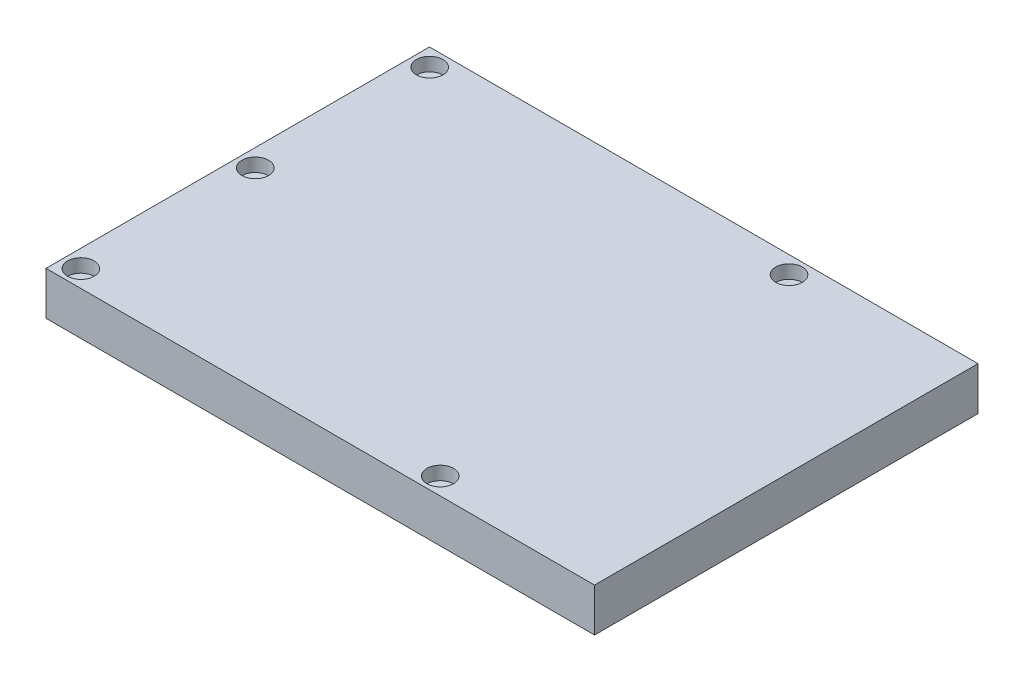
ISO-10303-21;
HEADER;
FILE_DESCRIPTION(('STEP AP214'),'2;1');
FILE_NAME('part.step','',(''),(''),'','','');
FILE_SCHEMA(('AUTOMOTIVE_DESIGN { 1 0 10303 214 1 1 1 1 }'));
ENDSEC;
DATA;
#1=APPLICATION_CONTEXT('core data for automotive mechanical design processes');
#2=APPLICATION_PROTOCOL_DEFINITION('international standard','automotive_design',2000,#1);
#3=PRODUCT_CONTEXT('',#1,'mechanical');
#4=PRODUCT('Part','Part','',(#3));
#5=PRODUCT_RELATED_PRODUCT_CATEGORY('part','',(#4));
#6=PRODUCT_DEFINITION_FORMATION('','',#4);
#7=PRODUCT_DEFINITION_CONTEXT('part definition',#1,'design');
#8=PRODUCT_DEFINITION('design','',#6,#7);
#9=PRODUCT_DEFINITION_SHAPE('','',#8);
#10=(LENGTH_UNIT() NAMED_UNIT(*) SI_UNIT(.MILLI.,.METRE.));
#11=(NAMED_UNIT(*) PLANE_ANGLE_UNIT() SI_UNIT($,.RADIAN.));
#12=(NAMED_UNIT(*) SI_UNIT($,.STERADIAN.) SOLID_ANGLE_UNIT());
#13=UNCERTAINTY_MEASURE_WITH_UNIT(LENGTH_MEASURE(1.E-05),#10,'distance_accuracy_value','');
#14=(GEOMETRIC_REPRESENTATION_CONTEXT(3) GLOBAL_UNCERTAINTY_ASSIGNED_CONTEXT((#13)) GLOBAL_UNIT_ASSIGNED_CONTEXT((#10,
#11,#12)) REPRESENTATION_CONTEXT('',''));
#15=CARTESIAN_POINT('',(0.,0.,0.));
#16=DIRECTION('',(0.,0.,1.));
#17=DIRECTION('',(1.,0.,0.));
#18=AXIS2_PLACEMENT_3D('',#15,#16,#17);
#19=CARTESIAN_POINT('',(63.336586242594,10.,-44.2744891451871));
#20=DIRECTION('',(0.,0.,1.));
#21=DIRECTION('',(1.,0.,0.));
#22=AXIS2_PLACEMENT_3D('',#19,#20,#21);
#23=PLANE('',#22);
#24=DIRECTION('',(-1.,0.,0.));
#25=VECTOR('',#24,1.);
#26=CARTESIAN_POINT('',(63.336586242594,0.,-44.2744891451871));
#27=LINE('',#26,#25);
#28=CARTESIAN_POINT('',(63.336586242594,0.,-44.2744891451871));
#29=VERTEX_POINT('',#28);
#30=CARTESIAN_POINT('',(-63.336586242594,0.,-44.2744891451871));
#31=VERTEX_POINT('',#30);
#32=EDGE_CURVE('E113',#29,#31,#27,.T.);
#33=ORIENTED_EDGE('',*,*,#32,.T.);
#34=DIRECTION('',(0.,-1.,0.));
#35=VECTOR('',#34,1.);
#36=CARTESIAN_POINT('',(-63.336586242594,10.,-44.2744891451871));
#37=LINE('',#36,#35);
#38=CARTESIAN_POINT('',(-63.336586242594,10.,-44.2744891451871));
#39=VERTEX_POINT('',#38);
#40=EDGE_CURVE('E11',#39,#31,#37,.T.);
#41=ORIENTED_EDGE('',*,*,#40,.F.);
#42=DIRECTION('',(-1.,0.,0.));
#43=VECTOR('',#42,1.);
#44=CARTESIAN_POINT('',(63.336586242594,10.,-44.2744891451871));
#45=LINE('',#44,#43);
#46=CARTESIAN_POINT('',(63.336586242594,10.,-44.2744891451871));
#47=VERTEX_POINT('',#46);
#48=EDGE_CURVE('E97',#47,#39,#45,.T.);
#49=ORIENTED_EDGE('',*,*,#48,.F.);
#50=DIRECTION('',(0.,-1.,0.));
#51=VECTOR('',#50,1.);
#52=CARTESIAN_POINT('',(63.336586242594,10.,-44.2744891451871));
#53=LINE('',#52,#51);
#54=EDGE_CURVE('E109',#47,#29,#53,.T.);
#55=ORIENTED_EDGE('',*,*,#54,.T.);
#56=EDGE_LOOP('',(#33,#41,#49,#55));
#57=FACE_BOUND('',#56,.T.);
#58=ADVANCED_FACE('F45',(#57),#23,.F.);
#59=CARTESIAN_POINT('',(-63.336586242594,10.,-44.2744891451871));
#60=DIRECTION('',(1.,0.,0.));
#61=DIRECTION('',(0.,0.,-1.));
#62=AXIS2_PLACEMENT_3D('',#59,#60,#61);
#63=PLANE('',#62);
#64=DIRECTION('',(0.,0.,1.));
#65=VECTOR('',#64,1.);
#66=CARTESIAN_POINT('',(-63.336586242594,0.,-44.2744891451871));
#67=LINE('',#66,#65);
#68=CARTESIAN_POINT('',(-63.336586242594,0.,44.2744891451871));
#69=VERTEX_POINT('',#68);
#70=EDGE_CURVE('E102',#31,#69,#67,.T.);
#71=ORIENTED_EDGE('',*,*,#70,.T.);
#72=DIRECTION('',(0.,-1.,0.));
#73=VECTOR('',#72,1.);
#74=CARTESIAN_POINT('',(-63.336586242594,10.,44.2744891451871));
#75=LINE('',#74,#73);
#76=CARTESIAN_POINT('',(-63.336586242594,10.,44.2744891451871));
#77=VERTEX_POINT('',#76);
#78=EDGE_CURVE('E54',#77,#69,#75,.T.);
#79=ORIENTED_EDGE('',*,*,#78,.F.);
#80=DIRECTION('',(0.,0.,1.));
#81=VECTOR('',#80,1.);
#82=CARTESIAN_POINT('',(-63.336586242594,10.,-44.2744891451871));
#83=LINE('',#82,#81);
#84=EDGE_CURVE('E92',#39,#77,#83,.T.);
#85=ORIENTED_EDGE('',*,*,#84,.F.);
#86=ORIENTED_EDGE('',*,*,#40,.T.);
#87=EDGE_LOOP('',(#71,#79,#85,#86));
#88=FACE_BOUND('',#87,.T.);
#89=ADVANCED_FACE('F101',(#88),#63,.F.);
#90=CARTESIAN_POINT('',(-63.336586242594,10.,44.2744891451871));
#91=DIRECTION('',(0.,0.,-1.));
#92=DIRECTION('',(-1.,0.,0.));
#93=AXIS2_PLACEMENT_3D('',#90,#91,#92);
#94=PLANE('',#93);
#95=DIRECTION('',(1.,0.,0.));
#96=VECTOR('',#95,1.);
#97=CARTESIAN_POINT('',(-63.336586242594,0.,44.2744891451871));
#98=LINE('',#97,#96);
#99=CARTESIAN_POINT('',(63.336586242594,0.,44.2744891451871));
#100=VERTEX_POINT('',#99);
#101=EDGE_CURVE('E79',#69,#100,#98,.T.);
#102=ORIENTED_EDGE('',*,*,#101,.T.);
#103=DIRECTION('',(0.,-1.,0.));
#104=VECTOR('',#103,1.);
#105=CARTESIAN_POINT('',(63.336586242594,10.,44.2744891451871));
#106=LINE('',#105,#104);
#107=CARTESIAN_POINT('',(63.336586242594,10.,44.2744891451871));
#108=VERTEX_POINT('',#107);
#109=EDGE_CURVE('E104',#108,#100,#106,.T.);
#110=ORIENTED_EDGE('',*,*,#109,.F.);
#111=DIRECTION('',(1.,0.,0.));
#112=VECTOR('',#111,1.);
#113=CARTESIAN_POINT('',(-63.336586242594,10.,44.2744891451871));
#114=LINE('',#113,#112);
#115=EDGE_CURVE('E95',#77,#108,#114,.T.);
#116=ORIENTED_EDGE('',*,*,#115,.F.);
#117=ORIENTED_EDGE('',*,*,#78,.T.);
#118=EDGE_LOOP('',(#102,#110,#116,#117));
#119=FACE_BOUND('',#118,.T.);
#120=ADVANCED_FACE('F105',(#119),#94,.F.);
#121=CARTESIAN_POINT('',(63.336586242594,10.,44.2744891451871));
#122=DIRECTION('',(-1.,0.,0.));
#123=DIRECTION('',(0.,0.,1.));
#124=AXIS2_PLACEMENT_3D('',#121,#122,#123);
#125=PLANE('',#124);
#126=DIRECTION('',(0.,0.,-1.));
#127=VECTOR('',#126,1.);
#128=CARTESIAN_POINT('',(63.336586242594,0.,44.2744891451871));
#129=LINE('',#128,#127);
#130=EDGE_CURVE('E85',#100,#29,#129,.T.);
#131=ORIENTED_EDGE('',*,*,#130,.T.);
#132=ORIENTED_EDGE('',*,*,#54,.F.);
#133=DIRECTION('',(0.,0.,-1.));
#134=VECTOR('',#133,1.);
#135=CARTESIAN_POINT('',(63.336586242594,10.,44.2744891451871));
#136=LINE('',#135,#134);
#137=EDGE_CURVE('E62',#108,#47,#136,.T.);
#138=ORIENTED_EDGE('',*,*,#137,.F.);
#139=ORIENTED_EDGE('',*,*,#109,.T.);
#140=EDGE_LOOP('',(#131,#132,#138,#139));
#141=FACE_BOUND('',#140,.T.);
#142=ADVANCED_FACE('F127',(#141),#125,.F.);
#143=CARTESIAN_POINT('',(0.,10.,0.));
#144=DIRECTION('',(0.,1.,0.));
#145=DIRECTION('',(0.,0.,1.));
#146=AXIS2_PLACEMENT_3D('',#143,#144,#145);
#147=PLANE('',#146);
#148=CARTESIAN_POINT('',(23.7198426761266,10.,-40.2490943681592));
#149=DIRECTION('',(0.,1.,0.));
#150=DIRECTION('',(0.,0.,1.));
#151=AXIS2_PLACEMENT_3D('',#148,#149,#150);
#152=CIRCLE('',#151,3.07499999999999);
#153=CARTESIAN_POINT('',(23.7198426761266,10.,-37.1740943681592));
#154=VERTEX_POINT('',#153);
#155=EDGE_CURVE('E146',#154,#154,#152,.T.);
#156=ORIENTED_EDGE('',*,*,#155,.F.);
#157=EDGE_LOOP('',(#156));
#158=FACE_BOUND('',#157,.T.);
#159=CARTESIAN_POINT('',(23.7198426761266,10.,40.2990575091822));
#160=DIRECTION('',(0.,1.,0.));
#161=DIRECTION('',(0.,0.,1.));
#162=AXIS2_PLACEMENT_3D('',#159,#160,#161);
#163=CIRCLE('',#162,3.07499999999999);
#164=CARTESIAN_POINT('',(23.7198426761266,10.,43.3740575091822));
#165=VERTEX_POINT('',#164);
#166=EDGE_CURVE('E154',#165,#165,#163,.T.);
#167=ORIENTED_EDGE('',*,*,#166,.F.);
#168=EDGE_LOOP('',(#167));
#169=FACE_BOUND('',#168,.T.);
#170=CARTESIAN_POINT('',(-59.2646422034682,10.,40.2990575091822));
#171=DIRECTION('',(0.,1.,0.));
#172=DIRECTION('',(0.,0.,1.));
#173=AXIS2_PLACEMENT_3D('',#170,#171,#172);
#174=CIRCLE('',#173,3.07499999999999);
#175=CARTESIAN_POINT('',(-59.2646422034682,10.,43.3740575091822));
#176=VERTEX_POINT('',#175);
#177=EDGE_CURVE('E162',#176,#176,#174,.T.);
#178=ORIENTED_EDGE('',*,*,#177,.F.);
#179=EDGE_LOOP('',(#178));
#180=FACE_BOUND('',#179,.T.);
#181=CARTESIAN_POINT('',(-59.2646422034682,10.,0.0249815705114721));
#182=DIRECTION('',(0.,1.,0.));
#183=DIRECTION('',(0.,0.,1.));
#184=AXIS2_PLACEMENT_3D('',#181,#182,#183);
#185=CIRCLE('',#184,3.07499999999999);
#186=CARTESIAN_POINT('',(-59.2646422034682,10.,3.09998157051146));
#187=VERTEX_POINT('',#186);
#188=EDGE_CURVE('E138',#187,#187,#185,.T.);
#189=ORIENTED_EDGE('',*,*,#188,.F.);
#190=EDGE_LOOP('',(#189));
#191=FACE_BOUND('',#190,.T.);
#192=CARTESIAN_POINT('',(-59.2646422034682,10.,-40.2490943681592));
#193=DIRECTION('',(0.,1.,0.));
#194=DIRECTION('',(0.,0.,1.));
#195=AXIS2_PLACEMENT_3D('',#192,#193,#194);
#196=CIRCLE('',#195,3.075);
#197=CARTESIAN_POINT('',(-59.2646422034682,10.,-37.1740943681592));
#198=VERTEX_POINT('',#197);
#199=EDGE_CURVE('E134',#198,#198,#196,.T.);
#200=ORIENTED_EDGE('',*,*,#199,.F.);
#201=EDGE_LOOP('',(#200));
#202=FACE_BOUND('',#201,.T.);
#203=ORIENTED_EDGE('',*,*,#48,.T.);
#204=ORIENTED_EDGE('',*,*,#84,.T.);
#205=ORIENTED_EDGE('',*,*,#115,.T.);
#206=ORIENTED_EDGE('',*,*,#137,.T.);
#207=EDGE_LOOP('',(#203,#204,#205,#206));
#208=FACE_BOUND('',#207,.T.);
#209=ADVANCED_FACE('F93',(#158,#169,#180,#191,#202,#208),#147,.T.);
#210=CARTESIAN_POINT('',(0.,0.,0.));
#211=DIRECTION('',(0.,1.,0.));
#212=DIRECTION('',(0.,0.,1.));
#213=AXIS2_PLACEMENT_3D('',#210,#211,#212);
#214=PLANE('',#213);
#215=ORIENTED_EDGE('',*,*,#32,.F.);
#216=ORIENTED_EDGE('',*,*,#130,.F.);
#217=ORIENTED_EDGE('',*,*,#101,.F.);
#218=ORIENTED_EDGE('',*,*,#70,.F.);
#219=EDGE_LOOP('',(#215,#216,#217,#218));
#220=FACE_BOUND('',#219,.T.);
#221=ADVANCED_FACE('F130',(#220),#214,.F.);
#222=CARTESIAN_POINT('',(-59.2646422034682,6.9,-40.2490943681592));
#223=DIRECTION('',(0.,1.,0.));
#224=DIRECTION('',(0.,0.,1.));
#225=AXIS2_PLACEMENT_3D('',#222,#223,#224);
#226=CYLINDRICAL_SURFACE('',#225,3.075);
#227=CARTESIAN_POINT('',(-59.2646422034682,6.9,-40.2490943681592));
#228=DIRECTION('',(0.,1.,0.));
#229=DIRECTION('',(0.,0.,1.));
#230=AXIS2_PLACEMENT_3D('',#227,#228,#229);
#231=CIRCLE('',#230,3.075);
#232=CARTESIAN_POINT('',(-59.2646422034682,6.9,-37.1740943681592));
#233=VERTEX_POINT('',#232);
#234=EDGE_CURVE('E117',#233,#233,#231,.T.);
#235=CARTESIAN_POINT('',(-59.2646422034682,6.9,-37.1740943681592));
#236=CARTESIAN_POINT('',(-59.2646422034682,6.93229166666667,-37.1740943681592));
#237=CARTESIAN_POINT('',(-59.2646422034682,6.96458333333333,-37.1740943681592));
#238=CARTESIAN_POINT('',(-59.2646422034682,7.02916666666667,-37.1740943681592));
#239=CARTESIAN_POINT('',(-59.2646422034682,7.06145833333333,-37.1740943681592));
#240=CARTESIAN_POINT('',(-59.2646422034682,7.12604166666667,-37.1740943681592));
#241=CARTESIAN_POINT('',(-59.2646422034682,7.15833333333333,-37.1740943681592));
#242=CARTESIAN_POINT('',(-59.2646422034682,7.22291666666667,-37.1740943681592));
#243=CARTESIAN_POINT('',(-59.2646422034682,7.25520833333333,-37.1740943681592));
#244=CARTESIAN_POINT('',(-59.2646422034682,7.31979166666667,-37.1740943681592));
#245=CARTESIAN_POINT('',(-59.2646422034682,7.35208333333333,-37.1740943681592));
#246=CARTESIAN_POINT('',(-59.2646422034682,7.41666666666667,-37.1740943681592));
#247=CARTESIAN_POINT('',(-59.2646422034682,7.44895833333333,-37.1740943681592));
#248=CARTESIAN_POINT('',(-59.2646422034682,7.51354166666667,-37.1740943681592));
#249=CARTESIAN_POINT('',(-59.2646422034682,7.54583333333333,-37.1740943681592));
#250=CARTESIAN_POINT('',(-59.2646422034682,7.61041666666667,-37.1740943681592));
#251=CARTESIAN_POINT('',(-59.2646422034682,7.64270833333333,-37.1740943681592));
#252=CARTESIAN_POINT('',(-59.2646422034682,7.70729166666667,-37.1740943681592));
#253=CARTESIAN_POINT('',(-59.2646422034682,7.73958333333333,-37.1740943681592));
#254=CARTESIAN_POINT('',(-59.2646422034682,7.80416666666667,-37.1740943681592));
#255=CARTESIAN_POINT('',(-59.2646422034682,7.83645833333333,-37.1740943681592));
#256=CARTESIAN_POINT('',(-59.2646422034682,7.90104166666667,-37.1740943681592));
#257=CARTESIAN_POINT('',(-59.2646422034682,7.93333333333333,-37.1740943681592));
#258=CARTESIAN_POINT('',(-59.2646422034682,7.99791666666667,-37.1740943681592));
#259=CARTESIAN_POINT('',(-59.2646422034682,8.03020833333333,-37.1740943681592));
#260=CARTESIAN_POINT('',(-59.2646422034682,8.09479166666667,-37.1740943681592));
#261=CARTESIAN_POINT('',(-59.2646422034682,8.12708333333333,-37.1740943681592));
#262=CARTESIAN_POINT('',(-59.2646422034682,8.19166666666667,-37.1740943681592));
#263=CARTESIAN_POINT('',(-59.2646422034682,8.22395833333333,-37.1740943681592));
#264=CARTESIAN_POINT('',(-59.2646422034682,8.28854166666667,-37.1740943681592));
#265=CARTESIAN_POINT('',(-59.2646422034682,8.32083333333333,-37.1740943681592));
#266=CARTESIAN_POINT('',(-59.2646422034682,8.38541666666667,-37.1740943681592));
#267=CARTESIAN_POINT('',(-59.2646422034682,8.41770833333333,-37.1740943681592));
#268=CARTESIAN_POINT('',(-59.2646422034682,8.48229166666667,-37.1740943681592));
#269=CARTESIAN_POINT('',(-59.2646422034682,8.51458333333333,-37.1740943681592));
#270=CARTESIAN_POINT('',(-59.2646422034682,8.57916666666667,-37.1740943681592));
#271=CARTESIAN_POINT('',(-59.2646422034682,8.61145833333333,-37.1740943681592));
#272=CARTESIAN_POINT('',(-59.2646422034682,8.67604166666667,-37.1740943681592));
#273=CARTESIAN_POINT('',(-59.2646422034682,8.70833333333333,-37.1740943681592));
#274=CARTESIAN_POINT('',(-59.2646422034682,8.77291666666667,-37.1740943681592));
#275=CARTESIAN_POINT('',(-59.2646422034682,8.80520833333333,-37.1740943681592));
#276=CARTESIAN_POINT('',(-59.2646422034682,8.86979166666667,-37.1740943681592));
#277=CARTESIAN_POINT('',(-59.2646422034682,8.90208333333333,-37.1740943681592));
#278=CARTESIAN_POINT('',(-59.2646422034682,8.96666666666667,-37.1740943681592));
#279=CARTESIAN_POINT('',(-59.2646422034682,8.99895833333333,-37.1740943681592));
#280=CARTESIAN_POINT('',(-59.2646422034682,9.06354166666667,-37.1740943681592));
#281=CARTESIAN_POINT('',(-59.2646422034682,9.09583333333333,-37.1740943681592));
#282=CARTESIAN_POINT('',(-59.2646422034682,9.16041666666667,-37.1740943681592));
#283=CARTESIAN_POINT('',(-59.2646422034682,9.19270833333333,-37.1740943681592));
#284=CARTESIAN_POINT('',(-59.2646422034682,9.25729166666667,-37.1740943681592));
#285=CARTESIAN_POINT('',(-59.2646422034682,9.28958333333333,-37.1740943681592));
#286=CARTESIAN_POINT('',(-59.2646422034682,9.35416666666667,-37.1740943681592));
#287=CARTESIAN_POINT('',(-59.2646422034682,9.38645833333333,-37.1740943681592));
#288=CARTESIAN_POINT('',(-59.2646422034682,9.45104166666667,-37.1740943681592));
#289=CARTESIAN_POINT('',(-59.2646422034682,9.48333333333333,-37.1740943681592));
#290=CARTESIAN_POINT('',(-59.2646422034682,9.54791666666667,-37.1740943681592));
#291=CARTESIAN_POINT('',(-59.2646422034682,9.58020833333333,-37.1740943681592));
#292=CARTESIAN_POINT('',(-59.2646422034682,9.64479166666667,-37.1740943681592));
#293=CARTESIAN_POINT('',(-59.2646422034682,9.67708333333333,-37.1740943681592));
#294=CARTESIAN_POINT('',(-59.2646422034682,9.74166666666667,-37.1740943681592));
#295=CARTESIAN_POINT('',(-59.2646422034682,9.77395833333333,-37.1740943681592));
#296=CARTESIAN_POINT('',(-59.2646422034682,9.83854166666667,-37.1740943681592));
#297=CARTESIAN_POINT('',(-59.2646422034682,9.87083333333333,-37.1740943681592));
#298=CARTESIAN_POINT('',(-59.2646422034682,9.93541666666667,-37.1740943681592));
#299=CARTESIAN_POINT('',(-59.2646422034682,9.96770833333333,-37.1740943681592));
#300=CARTESIAN_POINT('',(-59.2646422034682,10.,-37.1740943681592));
#301=B_SPLINE_CURVE_WITH_KNOTS('',3,(#235,#236,#237,#238,#239,#240,#241,#242,#243,#244,#245,
#246,#247,#248,#249,#250,#251,#252,#253,#254,#255,#256,#257,#258,#259,#260,#261,#262,#263,#264,
#265,#266,#267,#268,#269,#270,#271,#272,#273,#274,#275,#276,#277,#278,#279,#280,#281,#282,#283,
#284,#285,#286,#287,#288,#289,#290,#291,#292,#293,#294,#295,#296,#297,#298,#299,#300),
.UNSPECIFIED.,.F.,.F.,(4,2,2,2,2,2,2,2,2,2,2,2,2,2,2,2,2,2,2,2,2,2,2,2,2,2,2,2,2,2,2,2,4),(0.,
0.0968749999999997,0.193749999999999,0.290624999999999,0.3875,0.484375,0.581249999999999,
0.678125,0.775,0.871874999999999,0.968749999999999,1.065625,1.1625,1.259375,1.35625,1.453125,
1.55,1.646875,1.74375,1.840625,1.9375,2.034375,2.13125,2.228125,2.325,2.421875,2.51875,2.615625,
2.7125,2.809375,2.90625,3.003125,3.1),.UNSPECIFIED.);
#302=EDGE_CURVE('BSEAM182',#233,#198,#301,.T.);
#303=ORIENTED_EDGE('',*,*,#234,.F.);
#304=ORIENTED_EDGE('',*,*,#199,.T.);
#305=ORIENTED_EDGE('',*,*,#302,.T.);
#306=ORIENTED_EDGE('',*,*,#302,.F.);
#307=EDGE_LOOP('',(#303,#305,#304,#306));
#308=FACE_BOUND('',#307,.T.);
#309=ADVANCED_FACE('F182',(#308),#226,.F.);
#310=CARTESIAN_POINT('',(-59.2646422034682,6.9,-40.2490943681592));
#311=DIRECTION('',(0.,1.,0.));
#312=DIRECTION('',(0.,0.,1.));
#313=AXIS2_PLACEMENT_3D('',#310,#311,#312);
#314=PLANE('',#313);
#315=ORIENTED_EDGE('',*,*,#234,.T.);
#316=EDGE_LOOP('',(#315));
#317=FACE_BOUND('',#316,.T.);
#318=ADVANCED_FACE('F184',(#317),#314,.T.);
#319=CARTESIAN_POINT('',(-59.2646422034682,6.9,0.0249815705114721));
#320=DIRECTION('',(0.,1.,0.));
#321=DIRECTION('',(0.,0.,1.));
#322=AXIS2_PLACEMENT_3D('',#319,#320,#321);
#323=CYLINDRICAL_SURFACE('',#322,3.07499999999999);
#324=CARTESIAN_POINT('',(-59.2646422034682,6.9,0.0249815705114721));
#325=DIRECTION('',(0.,1.,0.));
#326=DIRECTION('',(0.,0.,1.));
#327=AXIS2_PLACEMENT_3D('',#324,#325,#326);
#328=CIRCLE('',#327,3.07499999999999);
#329=CARTESIAN_POINT('',(-59.2646422034682,6.9,3.09998157051146));
#330=VERTEX_POINT('',#329);
#331=EDGE_CURVE('E166',#330,#330,#328,.T.);
#332=CARTESIAN_POINT('',(-59.2646422034682,6.9,3.09998157051146));
#333=CARTESIAN_POINT('',(-59.2646422034682,6.93229166666667,3.09998157051146));
#334=CARTESIAN_POINT('',(-59.2646422034682,6.96458333333333,3.09998157051146));
#335=CARTESIAN_POINT('',(-59.2646422034682,7.02916666666667,3.09998157051146));
#336=CARTESIAN_POINT('',(-59.2646422034682,7.06145833333333,3.09998157051146));
#337=CARTESIAN_POINT('',(-59.2646422034682,7.12604166666667,3.09998157051146));
#338=CARTESIAN_POINT('',(-59.2646422034682,7.15833333333333,3.09998157051146));
#339=CARTESIAN_POINT('',(-59.2646422034682,7.22291666666667,3.09998157051146));
#340=CARTESIAN_POINT('',(-59.2646422034682,7.25520833333333,3.09998157051146));
#341=CARTESIAN_POINT('',(-59.2646422034682,7.31979166666667,3.09998157051146));
#342=CARTESIAN_POINT('',(-59.2646422034682,7.35208333333333,3.09998157051146));
#343=CARTESIAN_POINT('',(-59.2646422034682,7.41666666666667,3.09998157051146));
#344=CARTESIAN_POINT('',(-59.2646422034682,7.44895833333333,3.09998157051146));
#345=CARTESIAN_POINT('',(-59.2646422034682,7.51354166666667,3.09998157051146));
#346=CARTESIAN_POINT('',(-59.2646422034682,7.54583333333333,3.09998157051146));
#347=CARTESIAN_POINT('',(-59.2646422034682,7.61041666666667,3.09998157051146));
#348=CARTESIAN_POINT('',(-59.2646422034682,7.64270833333333,3.09998157051146));
#349=CARTESIAN_POINT('',(-59.2646422034682,7.70729166666667,3.09998157051146));
#350=CARTESIAN_POINT('',(-59.2646422034682,7.73958333333333,3.09998157051146));
#351=CARTESIAN_POINT('',(-59.2646422034682,7.80416666666667,3.09998157051146));
#352=CARTESIAN_POINT('',(-59.2646422034682,7.83645833333333,3.09998157051146));
#353=CARTESIAN_POINT('',(-59.2646422034682,7.90104166666667,3.09998157051146));
#354=CARTESIAN_POINT('',(-59.2646422034682,7.93333333333333,3.09998157051146));
#355=CARTESIAN_POINT('',(-59.2646422034682,7.99791666666667,3.09998157051146));
#356=CARTESIAN_POINT('',(-59.2646422034682,8.03020833333333,3.09998157051146));
#357=CARTESIAN_POINT('',(-59.2646422034682,8.09479166666667,3.09998157051146));
#358=CARTESIAN_POINT('',(-59.2646422034682,8.12708333333333,3.09998157051146));
#359=CARTESIAN_POINT('',(-59.2646422034682,8.19166666666667,3.09998157051146));
#360=CARTESIAN_POINT('',(-59.2646422034682,8.22395833333333,3.09998157051146));
#361=CARTESIAN_POINT('',(-59.2646422034682,8.28854166666667,3.09998157051146));
#362=CARTESIAN_POINT('',(-59.2646422034682,8.32083333333333,3.09998157051146));
#363=CARTESIAN_POINT('',(-59.2646422034682,8.38541666666667,3.09998157051146));
#364=CARTESIAN_POINT('',(-59.2646422034682,8.41770833333333,3.09998157051146));
#365=CARTESIAN_POINT('',(-59.2646422034682,8.48229166666667,3.09998157051146));
#366=CARTESIAN_POINT('',(-59.2646422034682,8.51458333333333,3.09998157051146));
#367=CARTESIAN_POINT('',(-59.2646422034682,8.57916666666667,3.09998157051146));
#368=CARTESIAN_POINT('',(-59.2646422034682,8.61145833333333,3.09998157051146));
#369=CARTESIAN_POINT('',(-59.2646422034682,8.67604166666667,3.09998157051146));
#370=CARTESIAN_POINT('',(-59.2646422034682,8.70833333333333,3.09998157051146));
#371=CARTESIAN_POINT('',(-59.2646422034682,8.77291666666667,3.09998157051146));
#372=CARTESIAN_POINT('',(-59.2646422034682,8.80520833333333,3.09998157051146));
#373=CARTESIAN_POINT('',(-59.2646422034682,8.86979166666667,3.09998157051146));
#374=CARTESIAN_POINT('',(-59.2646422034682,8.90208333333333,3.09998157051146));
#375=CARTESIAN_POINT('',(-59.2646422034682,8.96666666666667,3.09998157051146));
#376=CARTESIAN_POINT('',(-59.2646422034682,8.99895833333333,3.09998157051146));
#377=CARTESIAN_POINT('',(-59.2646422034682,9.06354166666667,3.09998157051146));
#378=CARTESIAN_POINT('',(-59.2646422034682,9.09583333333333,3.09998157051146));
#379=CARTESIAN_POINT('',(-59.2646422034682,9.16041666666667,3.09998157051146));
#380=CARTESIAN_POINT('',(-59.2646422034682,9.19270833333333,3.09998157051146));
#381=CARTESIAN_POINT('',(-59.2646422034682,9.25729166666667,3.09998157051146));
#382=CARTESIAN_POINT('',(-59.2646422034682,9.28958333333333,3.09998157051146));
#383=CARTESIAN_POINT('',(-59.2646422034682,9.35416666666667,3.09998157051146));
#384=CARTESIAN_POINT('',(-59.2646422034682,9.38645833333333,3.09998157051146));
#385=CARTESIAN_POINT('',(-59.2646422034682,9.45104166666667,3.09998157051146));
#386=CARTESIAN_POINT('',(-59.2646422034682,9.48333333333333,3.09998157051146));
#387=CARTESIAN_POINT('',(-59.2646422034682,9.54791666666667,3.09998157051146));
#388=CARTESIAN_POINT('',(-59.2646422034682,9.58020833333333,3.09998157051146));
#389=CARTESIAN_POINT('',(-59.2646422034682,9.64479166666667,3.09998157051146));
#390=CARTESIAN_POINT('',(-59.2646422034682,9.67708333333333,3.09998157051146));
#391=CARTESIAN_POINT('',(-59.2646422034682,9.74166666666667,3.09998157051146));
#392=CARTESIAN_POINT('',(-59.2646422034682,9.77395833333333,3.09998157051146));
#393=CARTESIAN_POINT('',(-59.2646422034682,9.83854166666667,3.09998157051146));
#394=CARTESIAN_POINT('',(-59.2646422034682,9.87083333333333,3.09998157051146));
#395=CARTESIAN_POINT('',(-59.2646422034682,9.93541666666667,3.09998157051146));
#396=CARTESIAN_POINT('',(-59.2646422034682,9.96770833333333,3.09998157051146));
#397=CARTESIAN_POINT('',(-59.2646422034682,10.,3.09998157051146));
#398=B_SPLINE_CURVE_WITH_KNOTS('',3,(#332,#333,#334,#335,#336,#337,#338,#339,#340,#341,#342,
#343,#344,#345,#346,#347,#348,#349,#350,#351,#352,#353,#354,#355,#356,#357,#358,#359,#360,#361,
#362,#363,#364,#365,#366,#367,#368,#369,#370,#371,#372,#373,#374,#375,#376,#377,#378,#379,#380,
#381,#382,#383,#384,#385,#386,#387,#388,#389,#390,#391,#392,#393,#394,#395,#396,#397),
.UNSPECIFIED.,.F.,.F.,(4,2,2,2,2,2,2,2,2,2,2,2,2,2,2,2,2,2,2,2,2,2,2,2,2,2,2,2,2,2,2,2,4),(0.,
0.0968749999999997,0.193749999999999,0.290624999999999,0.3875,0.484375,0.581249999999999,
0.678125,0.775,0.871874999999999,0.968749999999999,1.065625,1.1625,1.259375,1.35625,1.453125,
1.55,1.646875,1.74375,1.840625,1.9375,2.034375,2.13125,2.228125,2.325,2.421875,2.51875,2.615625,
2.7125,2.809375,2.90625,3.003125,3.1),.UNSPECIFIED.);
#399=EDGE_CURVE('BSEAM174',#330,#187,#398,.T.);
#400=ORIENTED_EDGE('',*,*,#331,.F.);
#401=ORIENTED_EDGE('',*,*,#188,.T.);
#402=ORIENTED_EDGE('',*,*,#399,.T.);
#403=ORIENTED_EDGE('',*,*,#399,.F.);
#404=EDGE_LOOP('',(#400,#402,#401,#403));
#405=FACE_BOUND('',#404,.T.);
#406=ADVANCED_FACE('F174',(#405),#323,.F.);
#407=CARTESIAN_POINT('',(-59.2646422034682,6.9,0.0249815705114721));
#408=DIRECTION('',(0.,1.,0.));
#409=DIRECTION('',(0.,0.,1.));
#410=AXIS2_PLACEMENT_3D('',#407,#408,#409);
#411=PLANE('',#410);
#412=ORIENTED_EDGE('',*,*,#331,.T.);
#413=EDGE_LOOP('',(#412));
#414=FACE_BOUND('',#413,.T.);
#415=ADVANCED_FACE('F240',(#414),#411,.T.);
#416=CARTESIAN_POINT('',(-59.2646422034682,6.9,40.2990575091822));
#417=DIRECTION('',(0.,1.,0.));
#418=DIRECTION('',(0.,0.,1.));
#419=AXIS2_PLACEMENT_3D('',#416,#417,#418);
#420=CYLINDRICAL_SURFACE('',#419,3.07499999999999);
#421=CARTESIAN_POINT('',(-59.2646422034682,6.9,40.2990575091822));
#422=DIRECTION('',(0.,1.,0.));
#423=DIRECTION('',(0.,0.,1.));
#424=AXIS2_PLACEMENT_3D('',#421,#422,#423);
#425=CIRCLE('',#424,3.07499999999999);
#426=CARTESIAN_POINT('',(-59.2646422034682,6.9,43.3740575091822));
#427=VERTEX_POINT('',#426);
#428=EDGE_CURVE('E158',#427,#427,#425,.T.);
#429=CARTESIAN_POINT('',(-59.2646422034682,6.9,43.3740575091822));
#430=CARTESIAN_POINT('',(-59.2646422034682,6.93229166666667,43.3740575091822));
#431=CARTESIAN_POINT('',(-59.2646422034682,6.96458333333333,43.3740575091822));
#432=CARTESIAN_POINT('',(-59.2646422034682,7.02916666666667,43.3740575091822));
#433=CARTESIAN_POINT('',(-59.2646422034682,7.06145833333333,43.3740575091822));
#434=CARTESIAN_POINT('',(-59.2646422034682,7.12604166666667,43.3740575091822));
#435=CARTESIAN_POINT('',(-59.2646422034682,7.15833333333333,43.3740575091822));
#436=CARTESIAN_POINT('',(-59.2646422034682,7.22291666666667,43.3740575091822));
#437=CARTESIAN_POINT('',(-59.2646422034682,7.25520833333333,43.3740575091822));
#438=CARTESIAN_POINT('',(-59.2646422034682,7.31979166666667,43.3740575091822));
#439=CARTESIAN_POINT('',(-59.2646422034682,7.35208333333333,43.3740575091822));
#440=CARTESIAN_POINT('',(-59.2646422034682,7.41666666666667,43.3740575091822));
#441=CARTESIAN_POINT('',(-59.2646422034682,7.44895833333333,43.3740575091822));
#442=CARTESIAN_POINT('',(-59.2646422034682,7.51354166666667,43.3740575091822));
#443=CARTESIAN_POINT('',(-59.2646422034682,7.54583333333333,43.3740575091822));
#444=CARTESIAN_POINT('',(-59.2646422034682,7.61041666666667,43.3740575091822));
#445=CARTESIAN_POINT('',(-59.2646422034682,7.64270833333333,43.3740575091822));
#446=CARTESIAN_POINT('',(-59.2646422034682,7.70729166666667,43.3740575091822));
#447=CARTESIAN_POINT('',(-59.2646422034682,7.73958333333333,43.3740575091822));
#448=CARTESIAN_POINT('',(-59.2646422034682,7.80416666666667,43.3740575091822));
#449=CARTESIAN_POINT('',(-59.2646422034682,7.83645833333333,43.3740575091822));
#450=CARTESIAN_POINT('',(-59.2646422034682,7.90104166666667,43.3740575091822));
#451=CARTESIAN_POINT('',(-59.2646422034682,7.93333333333333,43.3740575091822));
#452=CARTESIAN_POINT('',(-59.2646422034682,7.99791666666667,43.3740575091822));
#453=CARTESIAN_POINT('',(-59.2646422034682,8.03020833333333,43.3740575091822));
#454=CARTESIAN_POINT('',(-59.2646422034682,8.09479166666667,43.3740575091822));
#455=CARTESIAN_POINT('',(-59.2646422034682,8.12708333333333,43.3740575091822));
#456=CARTESIAN_POINT('',(-59.2646422034682,8.19166666666667,43.3740575091822));
#457=CARTESIAN_POINT('',(-59.2646422034682,8.22395833333333,43.3740575091822));
#458=CARTESIAN_POINT('',(-59.2646422034682,8.28854166666667,43.3740575091822));
#459=CARTESIAN_POINT('',(-59.2646422034682,8.32083333333333,43.3740575091822));
#460=CARTESIAN_POINT('',(-59.2646422034682,8.38541666666667,43.3740575091822));
#461=CARTESIAN_POINT('',(-59.2646422034682,8.41770833333333,43.3740575091822));
#462=CARTESIAN_POINT('',(-59.2646422034682,8.48229166666667,43.3740575091822));
#463=CARTESIAN_POINT('',(-59.2646422034682,8.51458333333333,43.3740575091822));
#464=CARTESIAN_POINT('',(-59.2646422034682,8.57916666666667,43.3740575091822));
#465=CARTESIAN_POINT('',(-59.2646422034682,8.61145833333333,43.3740575091822));
#466=CARTESIAN_POINT('',(-59.2646422034682,8.67604166666667,43.3740575091822));
#467=CARTESIAN_POINT('',(-59.2646422034682,8.70833333333333,43.3740575091822));
#468=CARTESIAN_POINT('',(-59.2646422034682,8.77291666666667,43.3740575091822));
#469=CARTESIAN_POINT('',(-59.2646422034682,8.80520833333333,43.3740575091822));
#470=CARTESIAN_POINT('',(-59.2646422034682,8.86979166666667,43.3740575091822));
#471=CARTESIAN_POINT('',(-59.2646422034682,8.90208333333333,43.3740575091822));
#472=CARTESIAN_POINT('',(-59.2646422034682,8.96666666666667,43.3740575091822));
#473=CARTESIAN_POINT('',(-59.2646422034682,8.99895833333333,43.3740575091822));
#474=CARTESIAN_POINT('',(-59.2646422034682,9.06354166666667,43.3740575091822));
#475=CARTESIAN_POINT('',(-59.2646422034682,9.09583333333333,43.3740575091822));
#476=CARTESIAN_POINT('',(-59.2646422034682,9.16041666666667,43.3740575091822));
#477=CARTESIAN_POINT('',(-59.2646422034682,9.19270833333333,43.3740575091822));
#478=CARTESIAN_POINT('',(-59.2646422034682,9.25729166666667,43.3740575091822));
#479=CARTESIAN_POINT('',(-59.2646422034682,9.28958333333333,43.3740575091822));
#480=CARTESIAN_POINT('',(-59.2646422034682,9.35416666666667,43.3740575091822));
#481=CARTESIAN_POINT('',(-59.2646422034682,9.38645833333333,43.3740575091822));
#482=CARTESIAN_POINT('',(-59.2646422034682,9.45104166666667,43.3740575091822));
#483=CARTESIAN_POINT('',(-59.2646422034682,9.48333333333333,43.3740575091822));
#484=CARTESIAN_POINT('',(-59.2646422034682,9.54791666666667,43.3740575091822));
#485=CARTESIAN_POINT('',(-59.2646422034682,9.58020833333333,43.3740575091822));
#486=CARTESIAN_POINT('',(-59.2646422034682,9.64479166666667,43.3740575091822));
#487=CARTESIAN_POINT('',(-59.2646422034682,9.67708333333333,43.3740575091822));
#488=CARTESIAN_POINT('',(-59.2646422034682,9.74166666666667,43.3740575091822));
#489=CARTESIAN_POINT('',(-59.2646422034682,9.77395833333333,43.3740575091822));
#490=CARTESIAN_POINT('',(-59.2646422034682,9.83854166666667,43.3740575091822));
#491=CARTESIAN_POINT('',(-59.2646422034682,9.87083333333333,43.3740575091822));
#492=CARTESIAN_POINT('',(-59.2646422034682,9.93541666666667,43.3740575091822));
#493=CARTESIAN_POINT('',(-59.2646422034682,9.96770833333333,43.3740575091822));
#494=CARTESIAN_POINT('',(-59.2646422034682,10.,43.3740575091822));
#495=B_SPLINE_CURVE_WITH_KNOTS('',3,(#429,#430,#431,#432,#433,#434,#435,#436,#437,#438,#439,
#440,#441,#442,#443,#444,#445,#446,#447,#448,#449,#450,#451,#452,#453,#454,#455,#456,#457,#458,
#459,#460,#461,#462,#463,#464,#465,#466,#467,#468,#469,#470,#471,#472,#473,#474,#475,#476,#477,
#478,#479,#480,#481,#482,#483,#484,#485,#486,#487,#488,#489,#490,#491,#492,#493,#494),
.UNSPECIFIED.,.F.,.F.,(4,2,2,2,2,2,2,2,2,2,2,2,2,2,2,2,2,2,2,2,2,2,2,2,2,2,2,2,2,2,2,2,4),(0.,
0.0968749999999997,0.193749999999999,0.290624999999999,0.3875,0.484375,0.581249999999999,
0.678125,0.775,0.871874999999999,0.968749999999999,1.065625,1.1625,1.259375,1.35625,1.453125,
1.55,1.646875,1.74375,1.840625,1.9375,2.034375,2.13125,2.228125,2.325,2.421875,2.51875,2.615625,
2.7125,2.809375,2.90625,3.003125,3.1),.UNSPECIFIED.);
#496=EDGE_CURVE('BSEAM249',#427,#176,#495,.T.);
#497=ORIENTED_EDGE('',*,*,#428,.F.);
#498=ORIENTED_EDGE('',*,*,#177,.T.);
#499=ORIENTED_EDGE('',*,*,#496,.T.);
#500=ORIENTED_EDGE('',*,*,#496,.F.);
#501=EDGE_LOOP('',(#497,#499,#498,#500));
#502=FACE_BOUND('',#501,.T.);
#503=ADVANCED_FACE('F249',(#502),#420,.F.);
#504=CARTESIAN_POINT('',(-59.2646422034682,6.9,40.2990575091822));
#505=DIRECTION('',(0.,1.,0.));
#506=DIRECTION('',(0.,0.,1.));
#507=AXIS2_PLACEMENT_3D('',#504,#505,#506);
#508=PLANE('',#507);
#509=ORIENTED_EDGE('',*,*,#428,.T.);
#510=EDGE_LOOP('',(#509));
#511=FACE_BOUND('',#510,.T.);
#512=ADVANCED_FACE('F258',(#511),#508,.T.);
#513=CARTESIAN_POINT('',(23.7198426761266,6.9,40.2990575091822));
#514=DIRECTION('',(0.,1.,0.));
#515=DIRECTION('',(0.,0.,1.));
#516=AXIS2_PLACEMENT_3D('',#513,#514,#515);
#517=CYLINDRICAL_SURFACE('',#516,3.07499999999999);
#518=CARTESIAN_POINT('',(23.7198426761266,6.9,40.2990575091822));
#519=DIRECTION('',(0.,1.,0.));
#520=DIRECTION('',(0.,0.,1.));
#521=AXIS2_PLACEMENT_3D('',#518,#519,#520);
#522=CIRCLE('',#521,3.07499999999999);
#523=CARTESIAN_POINT('',(23.7198426761266,6.9,43.3740575091822));
#524=VERTEX_POINT('',#523);
#525=EDGE_CURVE('E150',#524,#524,#522,.T.);
#526=CARTESIAN_POINT('',(23.7198426761266,6.9,43.3740575091822));
#527=CARTESIAN_POINT('',(23.7198426761266,6.93229166666667,43.3740575091822));
#528=CARTESIAN_POINT('',(23.7198426761266,6.96458333333333,43.3740575091822));
#529=CARTESIAN_POINT('',(23.7198426761266,7.02916666666667,43.3740575091822));
#530=CARTESIAN_POINT('',(23.7198426761266,7.06145833333333,43.3740575091822));
#531=CARTESIAN_POINT('',(23.7198426761266,7.12604166666667,43.3740575091822));
#532=CARTESIAN_POINT('',(23.7198426761266,7.15833333333333,43.3740575091822));
#533=CARTESIAN_POINT('',(23.7198426761266,7.22291666666667,43.3740575091822));
#534=CARTESIAN_POINT('',(23.7198426761266,7.25520833333333,43.3740575091822));
#535=CARTESIAN_POINT('',(23.7198426761266,7.31979166666667,43.3740575091822));
#536=CARTESIAN_POINT('',(23.7198426761266,7.35208333333333,43.3740575091822));
#537=CARTESIAN_POINT('',(23.7198426761266,7.41666666666667,43.3740575091822));
#538=CARTESIAN_POINT('',(23.7198426761266,7.44895833333333,43.3740575091822));
#539=CARTESIAN_POINT('',(23.7198426761266,7.51354166666667,43.3740575091822));
#540=CARTESIAN_POINT('',(23.7198426761266,7.54583333333333,43.3740575091822));
#541=CARTESIAN_POINT('',(23.7198426761266,7.61041666666667,43.3740575091822));
#542=CARTESIAN_POINT('',(23.7198426761266,7.64270833333333,43.3740575091822));
#543=CARTESIAN_POINT('',(23.7198426761266,7.70729166666667,43.3740575091822));
#544=CARTESIAN_POINT('',(23.7198426761266,7.73958333333333,43.3740575091822));
#545=CARTESIAN_POINT('',(23.7198426761266,7.80416666666667,43.3740575091822));
#546=CARTESIAN_POINT('',(23.7198426761266,7.83645833333333,43.3740575091822));
#547=CARTESIAN_POINT('',(23.7198426761266,7.90104166666667,43.3740575091822));
#548=CARTESIAN_POINT('',(23.7198426761266,7.93333333333333,43.3740575091822));
#549=CARTESIAN_POINT('',(23.7198426761266,7.99791666666667,43.3740575091822));
#550=CARTESIAN_POINT('',(23.7198426761266,8.03020833333333,43.3740575091822));
#551=CARTESIAN_POINT('',(23.7198426761266,8.09479166666667,43.3740575091822));
#552=CARTESIAN_POINT('',(23.7198426761266,8.12708333333333,43.3740575091822));
#553=CARTESIAN_POINT('',(23.7198426761266,8.19166666666667,43.3740575091822));
#554=CARTESIAN_POINT('',(23.7198426761266,8.22395833333333,43.3740575091822));
#555=CARTESIAN_POINT('',(23.7198426761266,8.28854166666667,43.3740575091822));
#556=CARTESIAN_POINT('',(23.7198426761266,8.32083333333333,43.3740575091822));
#557=CARTESIAN_POINT('',(23.7198426761266,8.38541666666667,43.3740575091822));
#558=CARTESIAN_POINT('',(23.7198426761266,8.41770833333333,43.3740575091822));
#559=CARTESIAN_POINT('',(23.7198426761266,8.48229166666667,43.3740575091822));
#560=CARTESIAN_POINT('',(23.7198426761266,8.51458333333333,43.3740575091822));
#561=CARTESIAN_POINT('',(23.7198426761266,8.57916666666667,43.3740575091822));
#562=CARTESIAN_POINT('',(23.7198426761266,8.61145833333333,43.3740575091822));
#563=CARTESIAN_POINT('',(23.7198426761266,8.67604166666667,43.3740575091822));
#564=CARTESIAN_POINT('',(23.7198426761266,8.70833333333333,43.3740575091822));
#565=CARTESIAN_POINT('',(23.7198426761266,8.77291666666667,43.3740575091822));
#566=CARTESIAN_POINT('',(23.7198426761266,8.80520833333333,43.3740575091822));
#567=CARTESIAN_POINT('',(23.7198426761266,8.86979166666667,43.3740575091822));
#568=CARTESIAN_POINT('',(23.7198426761266,8.90208333333333,43.3740575091822));
#569=CARTESIAN_POINT('',(23.7198426761266,8.96666666666667,43.3740575091822));
#570=CARTESIAN_POINT('',(23.7198426761266,8.99895833333333,43.3740575091822));
#571=CARTESIAN_POINT('',(23.7198426761266,9.06354166666667,43.3740575091822));
#572=CARTESIAN_POINT('',(23.7198426761266,9.09583333333333,43.3740575091822));
#573=CARTESIAN_POINT('',(23.7198426761266,9.16041666666667,43.3740575091822));
#574=CARTESIAN_POINT('',(23.7198426761266,9.19270833333333,43.3740575091822));
#575=CARTESIAN_POINT('',(23.7198426761266,9.25729166666667,43.3740575091822));
#576=CARTESIAN_POINT('',(23.7198426761266,9.28958333333333,43.3740575091822));
#577=CARTESIAN_POINT('',(23.7198426761266,9.35416666666667,43.3740575091822));
#578=CARTESIAN_POINT('',(23.7198426761266,9.38645833333333,43.3740575091822));
#579=CARTESIAN_POINT('',(23.7198426761266,9.45104166666667,43.3740575091822));
#580=CARTESIAN_POINT('',(23.7198426761266,9.48333333333333,43.3740575091822));
#581=CARTESIAN_POINT('',(23.7198426761266,9.54791666666667,43.3740575091822));
#582=CARTESIAN_POINT('',(23.7198426761266,9.58020833333333,43.3740575091822));
#583=CARTESIAN_POINT('',(23.7198426761266,9.64479166666667,43.3740575091822));
#584=CARTESIAN_POINT('',(23.7198426761266,9.67708333333333,43.3740575091822));
#585=CARTESIAN_POINT('',(23.7198426761266,9.74166666666667,43.3740575091822));
#586=CARTESIAN_POINT('',(23.7198426761266,9.77395833333333,43.3740575091822));
#587=CARTESIAN_POINT('',(23.7198426761266,9.83854166666667,43.3740575091822));
#588=CARTESIAN_POINT('',(23.7198426761266,9.87083333333333,43.3740575091822));
#589=CARTESIAN_POINT('',(23.7198426761266,9.93541666666667,43.3740575091822));
#590=CARTESIAN_POINT('',(23.7198426761266,9.96770833333333,43.3740575091822));
#591=CARTESIAN_POINT('',(23.7198426761266,10.,43.3740575091822));
#592=B_SPLINE_CURVE_WITH_KNOTS('',3,(#526,#527,#528,#529,#530,#531,#532,#533,#534,#535,#536,
#537,#538,#539,#540,#541,#542,#543,#544,#545,#546,#547,#548,#549,#550,#551,#552,#553,#554,#555,
#556,#557,#558,#559,#560,#561,#562,#563,#564,#565,#566,#567,#568,#569,#570,#571,#572,#573,#574,
#575,#576,#577,#578,#579,#580,#581,#582,#583,#584,#585,#586,#587,#588,#589,#590,#591),
.UNSPECIFIED.,.F.,.F.,(4,2,2,2,2,2,2,2,2,2,2,2,2,2,2,2,2,2,2,2,2,2,2,2,2,2,2,2,2,2,2,2,4),(0.,
0.0968749999999997,0.193749999999999,0.290624999999999,0.3875,0.484375,0.581249999999999,
0.678125,0.775,0.871874999999999,0.968749999999999,1.065625,1.1625,1.259375,1.35625,1.453125,
1.55,1.646875,1.74375,1.840625,1.9375,2.034375,2.13125,2.228125,2.325,2.421875,2.51875,2.615625,
2.7125,2.809375,2.90625,3.003125,3.1),.UNSPECIFIED.);
#593=EDGE_CURVE('BSEAM267',#524,#165,#592,.T.);
#594=ORIENTED_EDGE('',*,*,#525,.F.);
#595=ORIENTED_EDGE('',*,*,#166,.T.);
#596=ORIENTED_EDGE('',*,*,#593,.T.);
#597=ORIENTED_EDGE('',*,*,#593,.F.);
#598=EDGE_LOOP('',(#594,#596,#595,#597));
#599=FACE_BOUND('',#598,.T.);
#600=ADVANCED_FACE('F267',(#599),#517,.F.);
#601=CARTESIAN_POINT('',(23.7198426761266,6.9,40.2990575091822));
#602=DIRECTION('',(0.,1.,0.));
#603=DIRECTION('',(0.,0.,1.));
#604=AXIS2_PLACEMENT_3D('',#601,#602,#603);
#605=PLANE('',#604);
#606=ORIENTED_EDGE('',*,*,#525,.T.);
#607=EDGE_LOOP('',(#606));
#608=FACE_BOUND('',#607,.T.);
#609=ADVANCED_FACE('F276',(#608),#605,.T.);
#610=CARTESIAN_POINT('',(23.7198426761266,6.9,-40.2490943681592));
#611=DIRECTION('',(0.,1.,0.));
#612=DIRECTION('',(0.,0.,1.));
#613=AXIS2_PLACEMENT_3D('',#610,#611,#612);
#614=CYLINDRICAL_SURFACE('',#613,3.07499999999999);
#615=CARTESIAN_POINT('',(23.7198426761266,6.9,-40.2490943681592));
#616=DIRECTION('',(0.,1.,0.));
#617=DIRECTION('',(0.,0.,1.));
#618=AXIS2_PLACEMENT_3D('',#615,#616,#617);
#619=CIRCLE('',#618,3.07499999999999);
#620=CARTESIAN_POINT('',(23.7198426761266,6.9,-37.1740943681592));
#621=VERTEX_POINT('',#620);
#622=EDGE_CURVE('E142',#621,#621,#619,.T.);
#623=CARTESIAN_POINT('',(23.7198426761266,6.9,-37.1740943681592));
#624=CARTESIAN_POINT('',(23.7198426761266,6.93229166666667,-37.1740943681592));
#625=CARTESIAN_POINT('',(23.7198426761266,6.96458333333333,-37.1740943681592));
#626=CARTESIAN_POINT('',(23.7198426761266,7.02916666666667,-37.1740943681592));
#627=CARTESIAN_POINT('',(23.7198426761266,7.06145833333333,-37.1740943681592));
#628=CARTESIAN_POINT('',(23.7198426761266,7.12604166666667,-37.1740943681592));
#629=CARTESIAN_POINT('',(23.7198426761266,7.15833333333333,-37.1740943681592));
#630=CARTESIAN_POINT('',(23.7198426761266,7.22291666666667,-37.1740943681592));
#631=CARTESIAN_POINT('',(23.7198426761266,7.25520833333333,-37.1740943681592));
#632=CARTESIAN_POINT('',(23.7198426761266,7.31979166666667,-37.1740943681592));
#633=CARTESIAN_POINT('',(23.7198426761266,7.35208333333333,-37.1740943681592));
#634=CARTESIAN_POINT('',(23.7198426761266,7.41666666666667,-37.1740943681592));
#635=CARTESIAN_POINT('',(23.7198426761266,7.44895833333333,-37.1740943681592));
#636=CARTESIAN_POINT('',(23.7198426761266,7.51354166666667,-37.1740943681592));
#637=CARTESIAN_POINT('',(23.7198426761266,7.54583333333333,-37.1740943681592));
#638=CARTESIAN_POINT('',(23.7198426761266,7.61041666666667,-37.1740943681592));
#639=CARTESIAN_POINT('',(23.7198426761266,7.64270833333333,-37.1740943681592));
#640=CARTESIAN_POINT('',(23.7198426761266,7.70729166666667,-37.1740943681592));
#641=CARTESIAN_POINT('',(23.7198426761266,7.73958333333333,-37.1740943681592));
#642=CARTESIAN_POINT('',(23.7198426761266,7.80416666666667,-37.1740943681592));
#643=CARTESIAN_POINT('',(23.7198426761266,7.83645833333333,-37.1740943681592));
#644=CARTESIAN_POINT('',(23.7198426761266,7.90104166666667,-37.1740943681592));
#645=CARTESIAN_POINT('',(23.7198426761266,7.93333333333333,-37.1740943681592));
#646=CARTESIAN_POINT('',(23.7198426761266,7.99791666666667,-37.1740943681592));
#647=CARTESIAN_POINT('',(23.7198426761266,8.03020833333333,-37.1740943681592));
#648=CARTESIAN_POINT('',(23.7198426761266,8.09479166666667,-37.1740943681592));
#649=CARTESIAN_POINT('',(23.7198426761266,8.12708333333333,-37.1740943681592));
#650=CARTESIAN_POINT('',(23.7198426761266,8.19166666666667,-37.1740943681592));
#651=CARTESIAN_POINT('',(23.7198426761266,8.22395833333333,-37.1740943681592));
#652=CARTESIAN_POINT('',(23.7198426761266,8.28854166666667,-37.1740943681592));
#653=CARTESIAN_POINT('',(23.7198426761266,8.32083333333333,-37.1740943681592));
#654=CARTESIAN_POINT('',(23.7198426761266,8.38541666666667,-37.1740943681592));
#655=CARTESIAN_POINT('',(23.7198426761266,8.41770833333333,-37.1740943681592));
#656=CARTESIAN_POINT('',(23.7198426761266,8.48229166666667,-37.1740943681592));
#657=CARTESIAN_POINT('',(23.7198426761266,8.51458333333333,-37.1740943681592));
#658=CARTESIAN_POINT('',(23.7198426761266,8.57916666666667,-37.1740943681592));
#659=CARTESIAN_POINT('',(23.7198426761266,8.61145833333333,-37.1740943681592));
#660=CARTESIAN_POINT('',(23.7198426761266,8.67604166666667,-37.1740943681592));
#661=CARTESIAN_POINT('',(23.7198426761266,8.70833333333333,-37.1740943681592));
#662=CARTESIAN_POINT('',(23.7198426761266,8.77291666666667,-37.1740943681592));
#663=CARTESIAN_POINT('',(23.7198426761266,8.80520833333333,-37.1740943681592));
#664=CARTESIAN_POINT('',(23.7198426761266,8.86979166666667,-37.1740943681592));
#665=CARTESIAN_POINT('',(23.7198426761266,8.90208333333333,-37.1740943681592));
#666=CARTESIAN_POINT('',(23.7198426761266,8.96666666666667,-37.1740943681592));
#667=CARTESIAN_POINT('',(23.7198426761266,8.99895833333333,-37.1740943681592));
#668=CARTESIAN_POINT('',(23.7198426761266,9.06354166666667,-37.1740943681592));
#669=CARTESIAN_POINT('',(23.7198426761266,9.09583333333333,-37.1740943681592));
#670=CARTESIAN_POINT('',(23.7198426761266,9.16041666666667,-37.1740943681592));
#671=CARTESIAN_POINT('',(23.7198426761266,9.19270833333333,-37.1740943681592));
#672=CARTESIAN_POINT('',(23.7198426761266,9.25729166666667,-37.1740943681592));
#673=CARTESIAN_POINT('',(23.7198426761266,9.28958333333333,-37.1740943681592));
#674=CARTESIAN_POINT('',(23.7198426761266,9.35416666666667,-37.1740943681592));
#675=CARTESIAN_POINT('',(23.7198426761266,9.38645833333333,-37.1740943681592));
#676=CARTESIAN_POINT('',(23.7198426761266,9.45104166666667,-37.1740943681592));
#677=CARTESIAN_POINT('',(23.7198426761266,9.48333333333333,-37.1740943681592));
#678=CARTESIAN_POINT('',(23.7198426761266,9.54791666666667,-37.1740943681592));
#679=CARTESIAN_POINT('',(23.7198426761266,9.58020833333333,-37.1740943681592));
#680=CARTESIAN_POINT('',(23.7198426761266,9.64479166666667,-37.1740943681592));
#681=CARTESIAN_POINT('',(23.7198426761266,9.67708333333333,-37.1740943681592));
#682=CARTESIAN_POINT('',(23.7198426761266,9.74166666666667,-37.1740943681592));
#683=CARTESIAN_POINT('',(23.7198426761266,9.77395833333333,-37.1740943681592));
#684=CARTESIAN_POINT('',(23.7198426761266,9.83854166666667,-37.1740943681592));
#685=CARTESIAN_POINT('',(23.7198426761266,9.87083333333333,-37.1740943681592));
#686=CARTESIAN_POINT('',(23.7198426761266,9.93541666666667,-37.1740943681592));
#687=CARTESIAN_POINT('',(23.7198426761266,9.96770833333333,-37.1740943681592));
#688=CARTESIAN_POINT('',(23.7198426761266,10.,-37.1740943681592));
#689=B_SPLINE_CURVE_WITH_KNOTS('',3,(#623,#624,#625,#626,#627,#628,#629,#630,#631,#632,#633,
#634,#635,#636,#637,#638,#639,#640,#641,#642,#643,#644,#645,#646,#647,#648,#649,#650,#651,#652,
#653,#654,#655,#656,#657,#658,#659,#660,#661,#662,#663,#664,#665,#666,#667,#668,#669,#670,#671,
#672,#673,#674,#675,#676,#677,#678,#679,#680,#681,#682,#683,#684,#685,#686,#687,#688),
.UNSPECIFIED.,.F.,.F.,(4,2,2,2,2,2,2,2,2,2,2,2,2,2,2,2,2,2,2,2,2,2,2,2,2,2,2,2,2,2,2,2,4),(0.,
0.0968749999999997,0.193749999999999,0.290624999999999,0.3875,0.484375,0.581249999999999,
0.678125,0.775,0.871874999999999,0.968749999999999,1.065625,1.1625,1.259375,1.35625,1.453125,
1.55,1.646875,1.74375,1.840625,1.9375,2.034375,2.13125,2.228125,2.325,2.421875,2.51875,2.615625,
2.7125,2.809375,2.90625,3.003125,3.1),.UNSPECIFIED.);
#690=EDGE_CURVE('BSEAM285',#621,#154,#689,.T.);
#691=ORIENTED_EDGE('',*,*,#622,.F.);
#692=ORIENTED_EDGE('',*,*,#155,.T.);
#693=ORIENTED_EDGE('',*,*,#690,.T.);
#694=ORIENTED_EDGE('',*,*,#690,.F.);
#695=EDGE_LOOP('',(#691,#693,#692,#694));
#696=FACE_BOUND('',#695,.T.);
#697=ADVANCED_FACE('F285',(#696),#614,.F.);
#698=CARTESIAN_POINT('',(23.7198426761266,6.9,-40.2490943681592));
#699=DIRECTION('',(0.,1.,0.));
#700=DIRECTION('',(0.,0.,1.));
#701=AXIS2_PLACEMENT_3D('',#698,#699,#700);
#702=PLANE('',#701);
#703=ORIENTED_EDGE('',*,*,#622,.T.);
#704=EDGE_LOOP('',(#703));
#705=FACE_BOUND('',#704,.T.);
#706=ADVANCED_FACE('F294',(#705),#702,.T.);
#707=CLOSED_SHELL('',(#58,#89,#120,#142,#209,#221,#309,#318,#406,#415,#503,#512,#600,#609,#697,#706));
#708=MANIFOLD_SOLID_BREP('B2',#707);
#709=ADVANCED_BREP_SHAPE_REPRESENTATION('',(#18,#708),#14);
#710=SHAPE_DEFINITION_REPRESENTATION(#9,#709);
ENDSEC;
END-ISO-10303-21;
